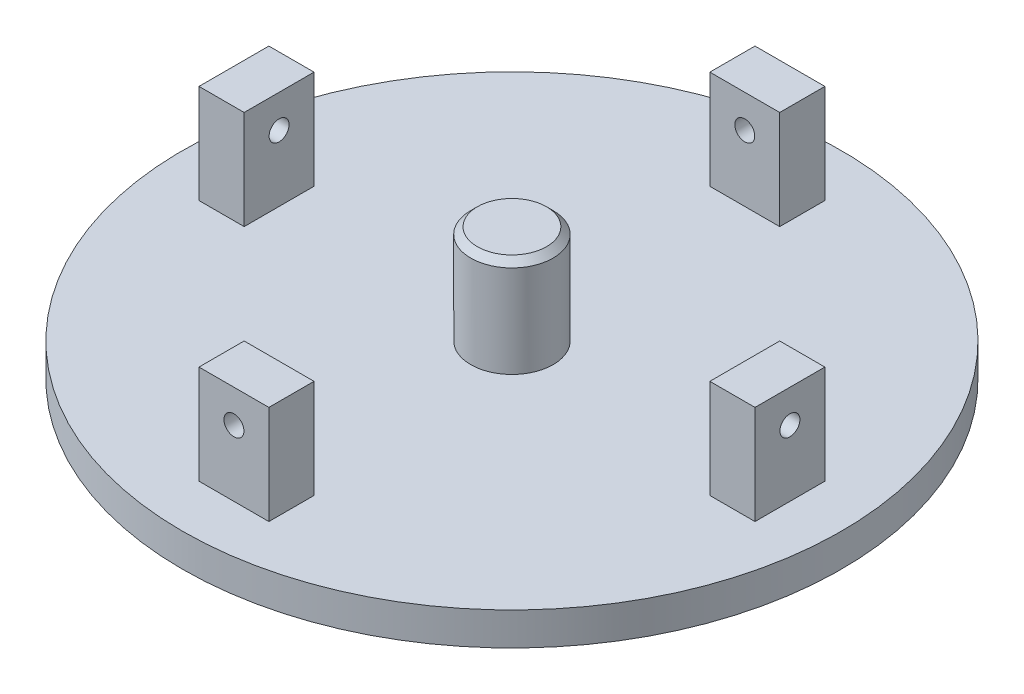
ISO-10303-21;
HEADER;
FILE_DESCRIPTION(('STEP AP214'),'2;1');
FILE_NAME('part.step','',(''),(''),'','','');
FILE_SCHEMA(('AUTOMOTIVE_DESIGN { 1 0 10303 214 1 1 1 1 }'));
ENDSEC;
DATA;
#1=APPLICATION_CONTEXT('core data for automotive mechanical design processes');
#2=APPLICATION_PROTOCOL_DEFINITION('international standard','automotive_design',2000,#1);
#3=PRODUCT_CONTEXT('',#1,'mechanical');
#4=PRODUCT('Part','Part','',(#3));
#5=PRODUCT_RELATED_PRODUCT_CATEGORY('part','',(#4));
#6=PRODUCT_DEFINITION_FORMATION('','',#4);
#7=PRODUCT_DEFINITION_CONTEXT('part definition',#1,'design');
#8=PRODUCT_DEFINITION('design','',#6,#7);
#9=PRODUCT_DEFINITION_SHAPE('','',#8);
#10=(LENGTH_UNIT() NAMED_UNIT(*) SI_UNIT(.MILLI.,.METRE.));
#11=(NAMED_UNIT(*) PLANE_ANGLE_UNIT() SI_UNIT($,.RADIAN.));
#12=(NAMED_UNIT(*) SI_UNIT($,.STERADIAN.) SOLID_ANGLE_UNIT());
#13=UNCERTAINTY_MEASURE_WITH_UNIT(LENGTH_MEASURE(1.E-05),#10,'distance_accuracy_value','');
#14=(GEOMETRIC_REPRESENTATION_CONTEXT(3) GLOBAL_UNCERTAINTY_ASSIGNED_CONTEXT((#13)) GLOBAL_UNIT_ASSIGNED_CONTEXT((#10,
#11,#12)) REPRESENTATION_CONTEXT('',''));
#15=CARTESIAN_POINT('',(0.,0.,0.));
#16=DIRECTION('',(0.,0.,1.));
#17=DIRECTION('',(1.,0.,0.));
#18=AXIS2_PLACEMENT_3D('',#15,#16,#17);
#19=CARTESIAN_POINT('',(0.,10.,0.));
#20=DIRECTION('',(0.,1.,0.));
#21=DIRECTION('',(0.,0.,1.));
#22=AXIS2_PLACEMENT_3D('',#19,#20,#21);
#23=PLANE('',#22);
#24=CARTESIAN_POINT('',(0.,10.,0.));
#25=DIRECTION('',(0.,1.,0.));
#26=DIRECTION('',(0.,0.,1.));
#27=AXIS2_PLACEMENT_3D('',#24,#25,#26);
#28=CIRCLE('',#27,12.5);
#29=CARTESIAN_POINT('',(0.,10.,12.5));
#30=VERTEX_POINT('',#29);
#31=EDGE_CURVE('E635',#30,#30,#28,.T.);
#32=ORIENTED_EDGE('',*,*,#31,.F.);
#33=EDGE_LOOP('',(#32));
#34=FACE_BOUND('',#33,.T.);
#35=CARTESIAN_POINT('',(0.,10.,0.));
#36=DIRECTION('',(0.,1.,0.));
#37=DIRECTION('',(0.,0.,1.));
#38=AXIS2_PLACEMENT_3D('',#35,#36,#37);
#39=CIRCLE('',#38,100.);
#40=CARTESIAN_POINT('',(0.,10.,100.));
#41=VERTEX_POINT('',#40);
#42=EDGE_CURVE('E265',#41,#41,#39,.T.);
#43=ORIENTED_EDGE('',*,*,#42,.T.);
#44=EDGE_LOOP('',(#43));
#45=FACE_BOUND('',#44,.T.);
#46=DIRECTION('',(-1.,0.,0.));
#47=VECTOR('',#46,1.);
#48=CARTESIAN_POINT('',(70.65,10.,-10.6));
#49=LINE('',#48,#47);
#50=CARTESIAN_POINT('',(84.35,10.,-10.6));
#51=VERTEX_POINT('',#50);
#52=CARTESIAN_POINT('',(70.65,10.,-10.6));
#53=VERTEX_POINT('',#52);
#54=EDGE_CURVE('E249',#51,#53,#49,.T.);
#55=ORIENTED_EDGE('',*,*,#54,.F.);
#56=DIRECTION('',(0.,0.,-1.));
#57=VECTOR('',#56,1.);
#58=CARTESIAN_POINT('',(84.35,10.,-10.6));
#59=LINE('',#58,#57);
#60=CARTESIAN_POINT('',(84.35,10.,10.6));
#61=VERTEX_POINT('',#60);
#62=EDGE_CURVE('E235',#61,#51,#59,.T.);
#63=ORIENTED_EDGE('',*,*,#62,.F.);
#64=DIRECTION('',(1.,0.,0.));
#65=VECTOR('',#64,1.);
#66=CARTESIAN_POINT('',(70.65,10.,10.6));
#67=LINE('',#66,#65);
#68=CARTESIAN_POINT('',(70.65,10.,10.6));
#69=VERTEX_POINT('',#68);
#70=EDGE_CURVE('E240',#69,#61,#67,.T.);
#71=ORIENTED_EDGE('',*,*,#70,.F.);
#72=DIRECTION('',(0.,0.,1.));
#73=VECTOR('',#72,1.);
#74=CARTESIAN_POINT('',(70.65,10.,-10.6));
#75=LINE('',#74,#73);
#76=EDGE_CURVE('E251',#53,#69,#75,.T.);
#77=ORIENTED_EDGE('',*,*,#76,.F.);
#78=EDGE_LOOP('',(#55,#63,#71,#77));
#79=FACE_BOUND('',#78,.T.);
#80=DIRECTION('',(1.,0.,0.));
#81=VECTOR('',#80,1.);
#82=CARTESIAN_POINT('',(10.6000000000091,10.,84.3500000000068));
#83=LINE('',#82,#81);
#84=CARTESIAN_POINT('',(-10.5999999999909,10.,84.3500000000068));
#85=VERTEX_POINT('',#84);
#86=CARTESIAN_POINT('',(10.6000000000091,10.,84.3500000000068));
#87=VERTEX_POINT('',#86);
#88=EDGE_CURVE('E220',#85,#87,#83,.T.);
#89=ORIENTED_EDGE('',*,*,#88,.F.);
#90=DIRECTION('',(0.,0.,1.));
#91=VECTOR('',#90,1.);
#92=CARTESIAN_POINT('',(-10.5999999999909,10.,70.6500000000068));
#93=LINE('',#92,#91);
#94=CARTESIAN_POINT('',(-10.5999999999909,10.,70.6500000000068));
#95=VERTEX_POINT('',#94);
#96=EDGE_CURVE('E206',#95,#85,#93,.T.);
#97=ORIENTED_EDGE('',*,*,#96,.F.);
#98=DIRECTION('',(-1.,0.,0.));
#99=VECTOR('',#98,1.);
#100=CARTESIAN_POINT('',(10.6000000000091,10.,70.6500000000068));
#101=LINE('',#100,#99);
#102=CARTESIAN_POINT('',(10.6000000000091,10.,70.6500000000068));
#103=VERTEX_POINT('',#102);
#104=EDGE_CURVE('E211',#103,#95,#101,.T.);
#105=ORIENTED_EDGE('',*,*,#104,.F.);
#106=DIRECTION('',(0.,0.,-1.));
#107=VECTOR('',#106,1.);
#108=CARTESIAN_POINT('',(10.6000000000091,10.,70.6500000000068));
#109=LINE('',#108,#107);
#110=EDGE_CURVE('E222',#87,#103,#109,.T.);
#111=ORIENTED_EDGE('',*,*,#110,.F.);
#112=EDGE_LOOP('',(#89,#97,#105,#111));
#113=FACE_BOUND('',#112,.T.);
#114=DIRECTION('',(0.,0.,1.));
#115=VECTOR('',#114,1.);
#116=CARTESIAN_POINT('',(-84.3499999999977,10.,10.6000000000159));
#117=LINE('',#116,#115);
#118=CARTESIAN_POINT('',(-84.3499999999977,10.,-10.5999999999841));
#119=VERTEX_POINT('',#118);
#120=CARTESIAN_POINT('',(-84.3499999999977,10.,10.6000000000159));
#121=VERTEX_POINT('',#120);
#122=EDGE_CURVE('E178',#119,#121,#117,.T.);
#123=ORIENTED_EDGE('',*,*,#122,.F.);
#124=DIRECTION('',(-1.,0.,0.));
#125=VECTOR('',#124,1.);
#126=CARTESIAN_POINT('',(-70.6499999999977,10.,-10.5999999999841));
#127=LINE('',#126,#125);
#128=CARTESIAN_POINT('',(-70.6499999999977,10.,-10.5999999999841));
#129=VERTEX_POINT('',#128);
#130=EDGE_CURVE('E175',#129,#119,#127,.T.);
#131=ORIENTED_EDGE('',*,*,#130,.F.);
#132=DIRECTION('',(0.,0.,-1.));
#133=VECTOR('',#132,1.);
#134=CARTESIAN_POINT('',(-70.6499999999977,10.,10.6000000000159));
#135=LINE('',#134,#133);
#136=CARTESIAN_POINT('',(-70.6499999999977,10.,10.6000000000159));
#137=VERTEX_POINT('',#136);
#138=EDGE_CURVE('E187',#137,#129,#135,.T.);
#139=ORIENTED_EDGE('',*,*,#138,.F.);
#140=DIRECTION('',(1.,0.,0.));
#141=VECTOR('',#140,1.);
#142=CARTESIAN_POINT('',(-70.6499999999977,10.,10.6000000000159));
#143=LINE('',#142,#141);
#144=EDGE_CURVE('E195',#121,#137,#143,.T.);
#145=ORIENTED_EDGE('',*,*,#144,.F.);
#146=EDGE_LOOP('',(#123,#131,#139,#145));
#147=FACE_BOUND('',#146,.T.);
#148=DIRECTION('',(-1.,0.,0.));
#149=VECTOR('',#148,1.);
#150=CARTESIAN_POINT('',(-10.6000000000069,10.,-84.3499999999909));
#151=LINE('',#150,#149);
#152=CARTESIAN_POINT('',(10.5999999999931,10.,-84.3499999999909));
#153=VERTEX_POINT('',#152);
#154=CARTESIAN_POINT('',(-10.6000000000069,10.,-84.3499999999909));
#155=VERTEX_POINT('',#154);
#156=EDGE_CURVE('E612',#153,#155,#151,.T.);
#157=ORIENTED_EDGE('',*,*,#156,.F.);
#158=DIRECTION('',(0.,0.,-1.));
#159=VECTOR('',#158,1.);
#160=CARTESIAN_POINT('',(10.5999999999931,10.,-70.6499999999909));
#161=LINE('',#160,#159);
#162=CARTESIAN_POINT('',(10.5999999999931,10.,-70.6499999999909));
#163=VERTEX_POINT('',#162);
#164=EDGE_CURVE('E173',#163,#153,#161,.T.);
#165=ORIENTED_EDGE('',*,*,#164,.F.);
#166=DIRECTION('',(1.,0.,0.));
#167=VECTOR('',#166,1.);
#168=CARTESIAN_POINT('',(-10.6000000000069,10.,-70.6499999999909));
#169=LINE('',#168,#167);
#170=CARTESIAN_POINT('',(-10.6000000000069,10.,-70.6499999999909));
#171=VERTEX_POINT('',#170);
#172=EDGE_CURVE('E169',#171,#163,#169,.T.);
#173=ORIENTED_EDGE('',*,*,#172,.F.);
#174=DIRECTION('',(0.,0.,1.));
#175=VECTOR('',#174,1.);
#176=CARTESIAN_POINT('',(-10.6000000000069,10.,-70.6499999999909));
#177=LINE('',#176,#175);
#178=EDGE_CURVE('E614',#155,#171,#177,.T.);
#179=ORIENTED_EDGE('',*,*,#178,.F.);
#180=EDGE_LOOP('',(#157,#165,#173,#179));
#181=FACE_BOUND('',#180,.T.);
#182=ADVANCED_FACE('F35',(#34,#45,#79,#113,#147,#181),#23,.T.);
#183=CARTESIAN_POINT('',(0.,10.,0.));
#184=DIRECTION('',(0.,-1.,0.));
#185=DIRECTION('',(0.,0.,-1.));
#186=AXIS2_PLACEMENT_3D('',#183,#184,#185);
#187=CYLINDRICAL_SURFACE('',#186,100.);
#188=ORIENTED_EDGE('',*,*,#42,.F.);
#189=EDGE_LOOP('',(#188));
#190=FACE_BOUND('',#189,.T.);
#191=CARTESIAN_POINT('',(0.,0.,0.));
#192=DIRECTION('',(0.,1.,0.));
#193=DIRECTION('',(0.,0.,1.));
#194=AXIS2_PLACEMENT_3D('',#191,#192,#193);
#195=CIRCLE('',#194,100.);
#196=CARTESIAN_POINT('',(0.,0.,100.));
#197=VERTEX_POINT('',#196);
#198=EDGE_CURVE('E264',#197,#197,#195,.T.);
#199=ORIENTED_EDGE('',*,*,#198,.T.);
#200=EDGE_LOOP('',(#199));
#201=FACE_BOUND('',#200,.T.);
#202=ADVANCED_FACE('F295',(#190,#201),#187,.T.);
#203=CARTESIAN_POINT('',(0.,0.,0.));
#204=DIRECTION('',(0.,1.,0.));
#205=DIRECTION('',(0.,0.,1.));
#206=AXIS2_PLACEMENT_3D('',#203,#204,#205);
#207=PLANE('',#206);
#208=ORIENTED_EDGE('',*,*,#198,.F.);
#209=EDGE_LOOP('',(#208));
#210=FACE_BOUND('',#209,.T.);
#211=ADVANCED_FACE('F301',(#210),#207,.F.);
#212=CARTESIAN_POINT('',(84.35,40.,-10.6));
#213=DIRECTION('',(-1.,0.,0.));
#214=DIRECTION('',(0.,0.,1.));
#215=AXIS2_PLACEMENT_3D('',#212,#213,#214);
#216=PLANE('',#215);
#217=CARTESIAN_POINT('',(84.35,30.,0.));
#218=DIRECTION('',(-1.,0.,0.));
#219=DIRECTION('',(0.,0.,1.));
#220=AXIS2_PLACEMENT_3D('',#217,#218,#219);
#221=CIRCLE('',#220,3.025);
#222=CARTESIAN_POINT('',(84.35,30.,3.025));
#223=VERTEX_POINT('',#222);
#224=EDGE_CURVE('E326',#223,#223,#221,.T.);
#225=ORIENTED_EDGE('',*,*,#224,.T.);
#226=EDGE_LOOP('',(#225));
#227=FACE_BOUND('',#226,.T.);
#228=ORIENTED_EDGE('',*,*,#62,.T.);
#229=DIRECTION('',(0.,-1.,0.));
#230=VECTOR('',#229,1.);
#231=CARTESIAN_POINT('',(84.35,40.,-10.6));
#232=LINE('',#231,#230);
#233=CARTESIAN_POINT('',(84.35,40.,-10.6));
#234=VERTEX_POINT('',#233);
#235=EDGE_CURVE('E262',#234,#51,#232,.T.);
#236=ORIENTED_EDGE('',*,*,#235,.F.);
#237=DIRECTION('',(0.,0.,-1.));
#238=VECTOR('',#237,1.);
#239=CARTESIAN_POINT('',(84.35,40.,-10.6));
#240=LINE('',#239,#238);
#241=CARTESIAN_POINT('',(84.35,40.,10.6));
#242=VERTEX_POINT('',#241);
#243=EDGE_CURVE('E236',#242,#234,#240,.T.);
#244=ORIENTED_EDGE('',*,*,#243,.F.);
#245=DIRECTION('',(0.,-1.,0.));
#246=VECTOR('',#245,1.);
#247=CARTESIAN_POINT('',(84.35,40.,10.6));
#248=LINE('',#247,#246);
#249=EDGE_CURVE('E246',#242,#61,#248,.T.);
#250=ORIENTED_EDGE('',*,*,#249,.T.);
#251=EDGE_LOOP('',(#228,#236,#244,#250));
#252=FACE_BOUND('',#251,.T.);
#253=ADVANCED_FACE('F307',(#227,#252),#216,.F.);
#254=CARTESIAN_POINT('',(70.65,40.,-10.6));
#255=DIRECTION('',(0.,0.,1.));
#256=DIRECTION('',(1.,0.,0.));
#257=AXIS2_PLACEMENT_3D('',#254,#255,#256);
#258=PLANE('',#257);
#259=ORIENTED_EDGE('',*,*,#54,.T.);
#260=DIRECTION('',(0.,-1.,0.));
#261=VECTOR('',#260,1.);
#262=CARTESIAN_POINT('',(70.65,40.,-10.6));
#263=LINE('',#262,#261);
#264=CARTESIAN_POINT('',(70.65,40.,-10.6));
#265=VERTEX_POINT('',#264);
#266=EDGE_CURVE('E259',#265,#53,#263,.T.);
#267=ORIENTED_EDGE('',*,*,#266,.F.);
#268=DIRECTION('',(-1.,0.,0.));
#269=VECTOR('',#268,1.);
#270=CARTESIAN_POINT('',(70.65,40.,-10.6));
#271=LINE('',#270,#269);
#272=EDGE_CURVE('E239',#234,#265,#271,.T.);
#273=ORIENTED_EDGE('',*,*,#272,.F.);
#274=ORIENTED_EDGE('',*,*,#235,.T.);
#275=EDGE_LOOP('',(#259,#267,#273,#274));
#276=FACE_BOUND('',#275,.T.);
#277=ADVANCED_FACE('F314',(#276),#258,.F.);
#278=CARTESIAN_POINT('',(70.65,40.,-10.6));
#279=DIRECTION('',(1.,0.,0.));
#280=DIRECTION('',(0.,0.,-1.));
#281=AXIS2_PLACEMENT_3D('',#278,#279,#280);
#282=PLANE('',#281);
#283=CARTESIAN_POINT('',(70.65,30.,0.));
#284=DIRECTION('',(1.,0.,0.));
#285=DIRECTION('',(0.,0.,-1.));
#286=AXIS2_PLACEMENT_3D('',#283,#284,#285);
#287=CIRCLE('',#286,3.025);
#288=CARTESIAN_POINT('',(70.65,30.,-3.025));
#289=VERTEX_POINT('',#288);
#290=EDGE_CURVE('E273',#289,#289,#287,.T.);
#291=ORIENTED_EDGE('',*,*,#290,.T.);
#292=EDGE_LOOP('',(#291));
#293=FACE_BOUND('',#292,.T.);
#294=ORIENTED_EDGE('',*,*,#76,.T.);
#295=DIRECTION('',(0.,-1.,0.));
#296=VECTOR('',#295,1.);
#297=CARTESIAN_POINT('',(70.65,40.,10.6));
#298=LINE('',#297,#296);
#299=CARTESIAN_POINT('',(70.65,40.,10.6));
#300=VERTEX_POINT('',#299);
#301=EDGE_CURVE('E257',#300,#69,#298,.T.);
#302=ORIENTED_EDGE('',*,*,#301,.F.);
#303=DIRECTION('',(0.,0.,1.));
#304=VECTOR('',#303,1.);
#305=CARTESIAN_POINT('',(70.65,40.,-10.6));
#306=LINE('',#305,#304);
#307=EDGE_CURVE('E242',#265,#300,#306,.T.);
#308=ORIENTED_EDGE('',*,*,#307,.F.);
#309=ORIENTED_EDGE('',*,*,#266,.T.);
#310=EDGE_LOOP('',(#294,#302,#308,#309));
#311=FACE_BOUND('',#310,.T.);
#312=ADVANCED_FACE('F321',(#293,#311),#282,.F.);
#313=CARTESIAN_POINT('',(70.65,40.,10.6));
#314=DIRECTION('',(0.,0.,-1.));
#315=DIRECTION('',(-1.,0.,0.));
#316=AXIS2_PLACEMENT_3D('',#313,#314,#315);
#317=PLANE('',#316);
#318=ORIENTED_EDGE('',*,*,#70,.T.);
#319=ORIENTED_EDGE('',*,*,#249,.F.);
#320=DIRECTION('',(1.,0.,0.));
#321=VECTOR('',#320,1.);
#322=CARTESIAN_POINT('',(70.65,40.,10.6));
#323=LINE('',#322,#321);
#324=EDGE_CURVE('E244',#300,#242,#323,.T.);
#325=ORIENTED_EDGE('',*,*,#324,.F.);
#326=ORIENTED_EDGE('',*,*,#301,.T.);
#327=EDGE_LOOP('',(#318,#319,#325,#326));
#328=FACE_BOUND('',#327,.T.);
#329=ADVANCED_FACE('F344',(#328),#317,.F.);
#330=CARTESIAN_POINT('',(0.,40.,0.));
#331=DIRECTION('',(0.,1.,0.));
#332=DIRECTION('',(0.,0.,1.));
#333=AXIS2_PLACEMENT_3D('',#330,#331,#332);
#334=PLANE('',#333);
#335=ORIENTED_EDGE('',*,*,#243,.T.);
#336=ORIENTED_EDGE('',*,*,#272,.T.);
#337=ORIENTED_EDGE('',*,*,#307,.T.);
#338=ORIENTED_EDGE('',*,*,#324,.T.);
#339=EDGE_LOOP('',(#335,#336,#337,#338));
#340=FACE_BOUND('',#339,.T.);
#341=ADVANCED_FACE('F342',(#340),#334,.T.);
#342=CARTESIAN_POINT('',(-10.5999999999909,40.,70.6500000000068));
#343=DIRECTION('',(1.,0.,0.));
#344=DIRECTION('',(0.,0.,-1.));
#345=AXIS2_PLACEMENT_3D('',#342,#343,#344);
#346=PLANE('',#345);
#347=ORIENTED_EDGE('',*,*,#96,.T.);
#348=DIRECTION('',(0.,-1.,0.));
#349=VECTOR('',#348,1.);
#350=CARTESIAN_POINT('',(-10.5999999999909,40.,84.3500000000068));
#351=LINE('',#350,#349);
#352=CARTESIAN_POINT('',(-10.5999999999909,40.,84.3500000000068));
#353=VERTEX_POINT('',#352);
#354=EDGE_CURVE('E233',#353,#85,#351,.T.);
#355=ORIENTED_EDGE('',*,*,#354,.F.);
#356=DIRECTION('',(0.,0.,1.));
#357=VECTOR('',#356,1.);
#358=CARTESIAN_POINT('',(-10.5999999999909,40.,70.6500000000068));
#359=LINE('',#358,#357);
#360=CARTESIAN_POINT('',(-10.5999999999909,40.,70.6500000000068));
#361=VERTEX_POINT('',#360);
#362=EDGE_CURVE('E207',#361,#353,#359,.T.);
#363=ORIENTED_EDGE('',*,*,#362,.F.);
#364=DIRECTION('',(0.,-1.,0.));
#365=VECTOR('',#364,1.);
#366=CARTESIAN_POINT('',(-10.5999999999909,40.,70.6500000000068));
#367=LINE('',#366,#365);
#368=EDGE_CURVE('E217',#361,#95,#367,.T.);
#369=ORIENTED_EDGE('',*,*,#368,.T.);
#370=EDGE_LOOP('',(#347,#355,#363,#369));
#371=FACE_BOUND('',#370,.T.);
#372=ADVANCED_FACE('F351',(#371),#346,.F.);
#373=CARTESIAN_POINT('',(10.6000000000091,40.,84.3500000000068));
#374=DIRECTION('',(0.,0.,-1.));
#375=DIRECTION('',(-1.,0.,0.));
#376=AXIS2_PLACEMENT_3D('',#373,#374,#375);
#377=PLANE('',#376);
#378=CARTESIAN_POINT('',(0.,30.,84.3500000000068));
#379=DIRECTION('',(0.,0.,1.));
#380=DIRECTION('',(1.,0.,0.));
#381=AXIS2_PLACEMENT_3D('',#378,#379,#380);
#382=CIRCLE('',#381,3.025);
#383=CARTESIAN_POINT('',(3.025,30.,84.3500000000068));
#384=VERTEX_POINT('',#383);
#385=EDGE_CURVE('E278',#384,#384,#382,.T.);
#386=ORIENTED_EDGE('',*,*,#385,.F.);
#387=EDGE_LOOP('',(#386));
#388=FACE_BOUND('',#387,.T.);
#389=ORIENTED_EDGE('',*,*,#88,.T.);
#390=DIRECTION('',(0.,-1.,0.));
#391=VECTOR('',#390,1.);
#392=CARTESIAN_POINT('',(10.6000000000091,40.,84.3500000000068));
#393=LINE('',#392,#391);
#394=CARTESIAN_POINT('',(10.6000000000091,40.,84.3500000000068));
#395=VERTEX_POINT('',#394);
#396=EDGE_CURVE('E230',#395,#87,#393,.T.);
#397=ORIENTED_EDGE('',*,*,#396,.F.);
#398=DIRECTION('',(1.,0.,0.));
#399=VECTOR('',#398,1.);
#400=CARTESIAN_POINT('',(10.6000000000091,40.,84.3500000000068));
#401=LINE('',#400,#399);
#402=EDGE_CURVE('E210',#353,#395,#401,.T.);
#403=ORIENTED_EDGE('',*,*,#402,.F.);
#404=ORIENTED_EDGE('',*,*,#354,.T.);
#405=EDGE_LOOP('',(#389,#397,#403,#404));
#406=FACE_BOUND('',#405,.T.);
#407=ADVANCED_FACE('F358',(#388,#406),#377,.F.);
#408=CARTESIAN_POINT('',(10.6000000000091,40.,70.6500000000068));
#409=DIRECTION('',(-1.,0.,0.));
#410=DIRECTION('',(0.,0.,1.));
#411=AXIS2_PLACEMENT_3D('',#408,#409,#410);
#412=PLANE('',#411);
#413=ORIENTED_EDGE('',*,*,#110,.T.);
#414=DIRECTION('',(0.,-1.,0.));
#415=VECTOR('',#414,1.);
#416=CARTESIAN_POINT('',(10.6000000000091,40.,70.6500000000068));
#417=LINE('',#416,#415);
#418=CARTESIAN_POINT('',(10.6000000000091,40.,70.6500000000068));
#419=VERTEX_POINT('',#418);
#420=EDGE_CURVE('E228',#419,#103,#417,.T.);
#421=ORIENTED_EDGE('',*,*,#420,.F.);
#422=DIRECTION('',(0.,0.,-1.));
#423=VECTOR('',#422,1.);
#424=CARTESIAN_POINT('',(10.6000000000091,40.,70.6500000000068));
#425=LINE('',#424,#423);
#426=EDGE_CURVE('E213',#395,#419,#425,.T.);
#427=ORIENTED_EDGE('',*,*,#426,.F.);
#428=ORIENTED_EDGE('',*,*,#396,.T.);
#429=EDGE_LOOP('',(#413,#421,#427,#428));
#430=FACE_BOUND('',#429,.T.);
#431=ADVANCED_FACE('F362',(#430),#412,.F.);
#432=CARTESIAN_POINT('',(10.6000000000091,40.,70.6500000000068));
#433=DIRECTION('',(0.,0.,1.));
#434=DIRECTION('',(1.,0.,0.));
#435=AXIS2_PLACEMENT_3D('',#432,#433,#434);
#436=PLANE('',#435);
#437=CARTESIAN_POINT('',(0.,30.,70.6500000000068));
#438=DIRECTION('',(0.,0.,1.));
#439=DIRECTION('',(1.,0.,0.));
#440=AXIS2_PLACEMENT_3D('',#437,#438,#439);
#441=CIRCLE('',#440,3.025);
#442=CARTESIAN_POINT('',(3.025,30.,70.6500000000068));
#443=VERTEX_POINT('',#442);
#444=EDGE_CURVE('E628',#443,#443,#441,.T.);
#445=ORIENTED_EDGE('',*,*,#444,.T.);
#446=EDGE_LOOP('',(#445));
#447=FACE_BOUND('',#446,.T.);
#448=ORIENTED_EDGE('',*,*,#104,.T.);
#449=ORIENTED_EDGE('',*,*,#368,.F.);
#450=DIRECTION('',(-1.,0.,0.));
#451=VECTOR('',#450,1.);
#452=CARTESIAN_POINT('',(10.6000000000091,40.,70.6500000000068));
#453=LINE('',#452,#451);
#454=EDGE_CURVE('E215',#419,#361,#453,.T.);
#455=ORIENTED_EDGE('',*,*,#454,.F.);
#456=ORIENTED_EDGE('',*,*,#420,.T.);
#457=EDGE_LOOP('',(#448,#449,#455,#456));
#458=FACE_BOUND('',#457,.T.);
#459=ADVANCED_FACE('F366',(#447,#458),#436,.F.);
#460=CARTESIAN_POINT('',(0.,40.,0.));
#461=DIRECTION('',(0.,-1.,0.));
#462=DIRECTION('',(0.,0.,-1.));
#463=AXIS2_PLACEMENT_3D('',#460,#461,#462);
#464=PLANE('',#463);
#465=ORIENTED_EDGE('',*,*,#362,.T.);
#466=ORIENTED_EDGE('',*,*,#402,.T.);
#467=ORIENTED_EDGE('',*,*,#426,.T.);
#468=ORIENTED_EDGE('',*,*,#454,.T.);
#469=EDGE_LOOP('',(#465,#466,#467,#468));
#470=FACE_BOUND('',#469,.T.);
#471=ADVANCED_FACE('F370',(#470),#464,.F.);
#472=CARTESIAN_POINT('',(-70.6499999999977,40.,-10.5999999999841));
#473=DIRECTION('',(0.,0.,1.));
#474=DIRECTION('',(1.,0.,0.));
#475=AXIS2_PLACEMENT_3D('',#472,#473,#474);
#476=PLANE('',#475);
#477=ORIENTED_EDGE('',*,*,#130,.T.);
#478=DIRECTION('',(0.,-1.,0.));
#479=VECTOR('',#478,1.);
#480=CARTESIAN_POINT('',(-84.3499999999977,40.,-10.5999999999841));
#481=LINE('',#480,#479);
#482=CARTESIAN_POINT('',(-84.3499999999977,40.,-10.5999999999841));
#483=VERTEX_POINT('',#482);
#484=EDGE_CURVE('E204',#483,#119,#481,.T.);
#485=ORIENTED_EDGE('',*,*,#484,.F.);
#486=DIRECTION('',(-1.,0.,0.));
#487=VECTOR('',#486,1.);
#488=CARTESIAN_POINT('',(-70.6499999999977,40.,-10.5999999999841));
#489=LINE('',#488,#487);
#490=CARTESIAN_POINT('',(-70.6499999999977,40.,-10.5999999999841));
#491=VERTEX_POINT('',#490);
#492=EDGE_CURVE('E183',#491,#483,#489,.T.);
#493=ORIENTED_EDGE('',*,*,#492,.F.);
#494=DIRECTION('',(0.,-1.,0.));
#495=VECTOR('',#494,1.);
#496=CARTESIAN_POINT('',(-70.6499999999977,40.,-10.5999999999841));
#497=LINE('',#496,#495);
#498=EDGE_CURVE('E192',#491,#129,#497,.T.);
#499=ORIENTED_EDGE('',*,*,#498,.T.);
#500=EDGE_LOOP('',(#477,#485,#493,#499));
#501=FACE_BOUND('',#500,.T.);
#502=ADVANCED_FACE('F374',(#501),#476,.F.);
#503=CARTESIAN_POINT('',(-84.3499999999977,40.,10.6000000000159));
#504=DIRECTION('',(1.,0.,0.));
#505=DIRECTION('',(0.,0.,-1.));
#506=AXIS2_PLACEMENT_3D('',#503,#504,#505);
#507=PLANE('',#506);
#508=CARTESIAN_POINT('',(-84.3499999999977,30.,0.));
#509=DIRECTION('',(-1.,0.,0.));
#510=DIRECTION('',(0.,0.,1.));
#511=AXIS2_PLACEMENT_3D('',#508,#509,#510);
#512=CIRCLE('',#511,3.025);
#513=CARTESIAN_POINT('',(-84.3499999999977,30.,3.025));
#514=VERTEX_POINT('',#513);
#515=EDGE_CURVE('E274',#514,#514,#512,.T.);
#516=ORIENTED_EDGE('',*,*,#515,.F.);
#517=EDGE_LOOP('',(#516));
#518=FACE_BOUND('',#517,.T.);
#519=ORIENTED_EDGE('',*,*,#122,.T.);
#520=DIRECTION('',(0.,-1.,0.));
#521=VECTOR('',#520,1.);
#522=CARTESIAN_POINT('',(-84.3499999999977,40.,10.6000000000159));
#523=LINE('',#522,#521);
#524=CARTESIAN_POINT('',(-84.3499999999977,40.,10.6000000000159));
#525=VERTEX_POINT('',#524);
#526=EDGE_CURVE('E201',#525,#121,#523,.T.);
#527=ORIENTED_EDGE('',*,*,#526,.F.);
#528=DIRECTION('',(0.,0.,1.));
#529=VECTOR('',#528,1.);
#530=CARTESIAN_POINT('',(-84.3499999999977,40.,10.6000000000159));
#531=LINE('',#530,#529);
#532=EDGE_CURVE('E186',#483,#525,#531,.T.);
#533=ORIENTED_EDGE('',*,*,#532,.F.);
#534=ORIENTED_EDGE('',*,*,#484,.T.);
#535=EDGE_LOOP('',(#519,#527,#533,#534));
#536=FACE_BOUND('',#535,.T.);
#537=ADVANCED_FACE('F378',(#518,#536),#507,.F.);
#538=CARTESIAN_POINT('',(-70.6499999999977,40.,10.6000000000159));
#539=DIRECTION('',(0.,0.,-1.));
#540=DIRECTION('',(-1.,0.,0.));
#541=AXIS2_PLACEMENT_3D('',#538,#539,#540);
#542=PLANE('',#541);
#543=ORIENTED_EDGE('',*,*,#144,.T.);
#544=DIRECTION('',(0.,-1.,0.));
#545=VECTOR('',#544,1.);
#546=CARTESIAN_POINT('',(-70.6499999999977,40.,10.6000000000159));
#547=LINE('',#546,#545);
#548=CARTESIAN_POINT('',(-70.6499999999977,40.,10.6000000000159));
#549=VERTEX_POINT('',#548);
#550=EDGE_CURVE('E59',#549,#137,#547,.T.);
#551=ORIENTED_EDGE('',*,*,#550,.F.);
#552=DIRECTION('',(1.,0.,0.));
#553=VECTOR('',#552,1.);
#554=CARTESIAN_POINT('',(-70.6499999999977,40.,10.6000000000159));
#555=LINE('',#554,#553);
#556=EDGE_CURVE('E189',#525,#549,#555,.T.);
#557=ORIENTED_EDGE('',*,*,#556,.F.);
#558=ORIENTED_EDGE('',*,*,#526,.T.);
#559=EDGE_LOOP('',(#543,#551,#557,#558));
#560=FACE_BOUND('',#559,.T.);
#561=ADVANCED_FACE('F382',(#560),#542,.F.);
#562=CARTESIAN_POINT('',(-70.6499999999977,40.,10.6000000000159));
#563=DIRECTION('',(-1.,0.,0.));
#564=DIRECTION('',(0.,0.,1.));
#565=AXIS2_PLACEMENT_3D('',#562,#563,#564);
#566=PLANE('',#565);
#567=CARTESIAN_POINT('',(-70.6499999999977,30.,0.));
#568=DIRECTION('',(-1.,0.,0.));
#569=DIRECTION('',(0.,0.,1.));
#570=AXIS2_PLACEMENT_3D('',#567,#568,#569);
#571=CIRCLE('',#570,3.025);
#572=CARTESIAN_POINT('',(-70.6499999999977,30.,3.025));
#573=VERTEX_POINT('',#572);
#574=EDGE_CURVE('E270',#573,#573,#571,.T.);
#575=ORIENTED_EDGE('',*,*,#574,.T.);
#576=EDGE_LOOP('',(#575));
#577=FACE_BOUND('',#576,.T.);
#578=ORIENTED_EDGE('',*,*,#138,.T.);
#579=ORIENTED_EDGE('',*,*,#498,.F.);
#580=DIRECTION('',(0.,0.,-1.));
#581=VECTOR('',#580,1.);
#582=CARTESIAN_POINT('',(-70.6499999999977,40.,10.6000000000159));
#583=LINE('',#582,#581);
#584=EDGE_CURVE('E191',#549,#491,#583,.T.);
#585=ORIENTED_EDGE('',*,*,#584,.F.);
#586=ORIENTED_EDGE('',*,*,#550,.T.);
#587=EDGE_LOOP('',(#578,#579,#585,#586));
#588=FACE_BOUND('',#587,.T.);
#589=ADVANCED_FACE('F386',(#577,#588),#566,.F.);
#590=CARTESIAN_POINT('',(0.,40.,0.));
#591=DIRECTION('',(0.,-1.,0.));
#592=DIRECTION('',(0.,0.,-1.));
#593=AXIS2_PLACEMENT_3D('',#590,#591,#592);
#594=PLANE('',#593);
#595=ORIENTED_EDGE('',*,*,#492,.T.);
#596=ORIENTED_EDGE('',*,*,#532,.T.);
#597=ORIENTED_EDGE('',*,*,#556,.T.);
#598=ORIENTED_EDGE('',*,*,#584,.T.);
#599=EDGE_LOOP('',(#595,#596,#597,#598));
#600=FACE_BOUND('',#599,.T.);
#601=ADVANCED_FACE('F390',(#600),#594,.F.);
#602=CARTESIAN_POINT('',(10.5999999999931,40.,-70.6499999999909));
#603=DIRECTION('',(-1.,0.,0.));
#604=DIRECTION('',(0.,0.,1.));
#605=AXIS2_PLACEMENT_3D('',#602,#603,#604);
#606=PLANE('',#605);
#607=ORIENTED_EDGE('',*,*,#164,.T.);
#608=DIRECTION('',(0.,-1.,0.));
#609=VECTOR('',#608,1.);
#610=CARTESIAN_POINT('',(10.5999999999931,40.,-84.3499999999909));
#611=LINE('',#610,#609);
#612=CARTESIAN_POINT('',(10.5999999999931,40.,-84.3499999999909));
#613=VERTEX_POINT('',#612);
#614=EDGE_CURVE('E154',#613,#153,#611,.T.);
#615=ORIENTED_EDGE('',*,*,#614,.F.);
#616=DIRECTION('',(0.,0.,-1.));
#617=VECTOR('',#616,1.);
#618=CARTESIAN_POINT('',(10.5999999999931,40.,-70.6499999999909));
#619=LINE('',#618,#617);
#620=CARTESIAN_POINT('',(10.5999999999931,40.,-70.6499999999909));
#621=VERTEX_POINT('',#620);
#622=EDGE_CURVE('E161',#621,#613,#619,.T.);
#623=ORIENTED_EDGE('',*,*,#622,.F.);
#624=DIRECTION('',(0.,-1.,0.));
#625=VECTOR('',#624,1.);
#626=CARTESIAN_POINT('',(10.5999999999931,40.,-70.6499999999909));
#627=LINE('',#626,#625);
#628=EDGE_CURVE('E621',#621,#163,#627,.T.);
#629=ORIENTED_EDGE('',*,*,#628,.T.);
#630=EDGE_LOOP('',(#607,#615,#623,#629));
#631=FACE_BOUND('',#630,.T.);
#632=ADVANCED_FACE('F171',(#631),#606,.F.);
#633=CARTESIAN_POINT('',(-10.6000000000069,40.,-84.3499999999909));
#634=DIRECTION('',(0.,0.,1.));
#635=DIRECTION('',(1.,0.,0.));
#636=AXIS2_PLACEMENT_3D('',#633,#634,#635);
#637=PLANE('',#636);
#638=CARTESIAN_POINT('',(0.,30.,-84.3499999999909));
#639=DIRECTION('',(0.,0.,1.));
#640=DIRECTION('',(1.,0.,0.));
#641=AXIS2_PLACEMENT_3D('',#638,#639,#640);
#642=CIRCLE('',#641,3.025);
#643=CARTESIAN_POINT('',(3.025,30.,-84.3499999999909));
#644=VERTEX_POINT('',#643);
#645=EDGE_CURVE('E277',#644,#644,#642,.T.);
#646=ORIENTED_EDGE('',*,*,#645,.T.);
#647=EDGE_LOOP('',(#646));
#648=FACE_BOUND('',#647,.T.);
#649=ORIENTED_EDGE('',*,*,#156,.T.);
#650=DIRECTION('',(0.,-1.,0.));
#651=VECTOR('',#650,1.);
#652=CARTESIAN_POINT('',(-10.6000000000069,40.,-84.3499999999909));
#653=LINE('',#652,#651);
#654=CARTESIAN_POINT('',(-10.6000000000069,40.,-84.3499999999909));
#655=VERTEX_POINT('',#654);
#656=EDGE_CURVE('E157',#655,#155,#653,.T.);
#657=ORIENTED_EDGE('',*,*,#656,.F.);
#658=DIRECTION('',(-1.,0.,0.));
#659=VECTOR('',#658,1.);
#660=CARTESIAN_POINT('',(-10.6000000000069,40.,-84.3499999999909));
#661=LINE('',#660,#659);
#662=EDGE_CURVE('E150',#613,#655,#661,.T.);
#663=ORIENTED_EDGE('',*,*,#662,.F.);
#664=ORIENTED_EDGE('',*,*,#614,.T.);
#665=EDGE_LOOP('',(#649,#657,#663,#664));
#666=FACE_BOUND('',#665,.T.);
#667=ADVANCED_FACE('F152',(#648,#666),#637,.F.);
#668=CARTESIAN_POINT('',(-10.6000000000069,40.,-70.6499999999909));
#669=DIRECTION('',(1.,0.,0.));
#670=DIRECTION('',(0.,0.,-1.));
#671=AXIS2_PLACEMENT_3D('',#668,#669,#670);
#672=PLANE('',#671);
#673=ORIENTED_EDGE('',*,*,#178,.T.);
#674=DIRECTION('',(0.,-1.,0.));
#675=VECTOR('',#674,1.);
#676=CARTESIAN_POINT('',(-10.6000000000069,40.,-70.6499999999909));
#677=LINE('',#676,#675);
#678=CARTESIAN_POINT('',(-10.6000000000069,40.,-70.6499999999909));
#679=VERTEX_POINT('',#678);
#680=EDGE_CURVE('E51',#679,#171,#677,.T.);
#681=ORIENTED_EDGE('',*,*,#680,.F.);
#682=DIRECTION('',(0.,0.,1.));
#683=VECTOR('',#682,1.);
#684=CARTESIAN_POINT('',(-10.6000000000069,40.,-70.6499999999909));
#685=LINE('',#684,#683);
#686=EDGE_CURVE('E160',#655,#679,#685,.T.);
#687=ORIENTED_EDGE('',*,*,#686,.F.);
#688=ORIENTED_EDGE('',*,*,#656,.T.);
#689=EDGE_LOOP('',(#673,#681,#687,#688));
#690=FACE_BOUND('',#689,.T.);
#691=ADVANCED_FACE('F399',(#690),#672,.F.);
#692=CARTESIAN_POINT('',(-10.6000000000069,40.,-70.6499999999909));
#693=DIRECTION('',(0.,0.,-1.));
#694=DIRECTION('',(-1.,0.,0.));
#695=AXIS2_PLACEMENT_3D('',#692,#693,#694);
#696=PLANE('',#695);
#697=CARTESIAN_POINT('',(0.,30.,-70.6499999999909));
#698=DIRECTION('',(0.,0.,-1.));
#699=DIRECTION('',(-1.,0.,0.));
#700=AXIS2_PLACEMENT_3D('',#697,#698,#699);
#701=CIRCLE('',#700,3.025);
#702=CARTESIAN_POINT('',(-3.025,30.,-70.6499999999909));
#703=VERTEX_POINT('',#702);
#704=EDGE_CURVE('E275',#703,#703,#701,.T.);
#705=ORIENTED_EDGE('',*,*,#704,.T.);
#706=EDGE_LOOP('',(#705));
#707=FACE_BOUND('',#706,.T.);
#708=ORIENTED_EDGE('',*,*,#172,.T.);
#709=ORIENTED_EDGE('',*,*,#628,.F.);
#710=DIRECTION('',(1.,0.,0.));
#711=VECTOR('',#710,1.);
#712=CARTESIAN_POINT('',(-10.6000000000069,40.,-70.6499999999909));
#713=LINE('',#712,#711);
#714=EDGE_CURVE('E165',#679,#621,#713,.T.);
#715=ORIENTED_EDGE('',*,*,#714,.F.);
#716=ORIENTED_EDGE('',*,*,#680,.T.);
#717=EDGE_LOOP('',(#708,#709,#715,#716));
#718=FACE_BOUND('',#717,.T.);
#719=ADVANCED_FACE('F403',(#707,#718),#696,.F.);
#720=CARTESIAN_POINT('',(0.,40.,0.));
#721=DIRECTION('',(0.,-1.,0.));
#722=DIRECTION('',(0.,0.,-1.));
#723=AXIS2_PLACEMENT_3D('',#720,#721,#722);
#724=PLANE('',#723);
#725=ORIENTED_EDGE('',*,*,#622,.T.);
#726=ORIENTED_EDGE('',*,*,#662,.T.);
#727=ORIENTED_EDGE('',*,*,#686,.T.);
#728=ORIENTED_EDGE('',*,*,#714,.T.);
#729=EDGE_LOOP('',(#725,#726,#727,#728));
#730=FACE_BOUND('',#729,.T.);
#731=ADVANCED_FACE('F164',(#730),#724,.F.);
#732=CARTESIAN_POINT('',(105.650000000002,30.,0.));
#733=DIRECTION('',(-1.,0.,0.));
#734=DIRECTION('',(0.,0.,1.));
#735=AXIS2_PLACEMENT_3D('',#732,#733,#734);
#736=CYLINDRICAL_SURFACE('',#735,3.025);
#737=ORIENTED_EDGE('',*,*,#515,.T.);
#738=EDGE_LOOP('',(#737));
#739=FACE_BOUND('',#738,.T.);
#740=ORIENTED_EDGE('',*,*,#574,.F.);
#741=EDGE_LOOP('',(#740));
#742=FACE_BOUND('',#741,.T.);
#743=ADVANCED_FACE('F410',(#739,#742),#736,.F.);
#744=ORIENTED_EDGE('',*,*,#290,.F.);
#745=EDGE_LOOP('',(#744));
#746=FACE_BOUND('',#745,.T.);
#747=ORIENTED_EDGE('',*,*,#224,.F.);
#748=EDGE_LOOP('',(#747));
#749=FACE_BOUND('',#748,.T.);
#750=ADVANCED_FACE('F411',(#746,#749),#736,.F.);
#751=CARTESIAN_POINT('',(0.,30.,-105.649999999993));
#752=DIRECTION('',(0.,0.,1.));
#753=DIRECTION('',(1.,0.,0.));
#754=AXIS2_PLACEMENT_3D('',#751,#752,#753);
#755=CYLINDRICAL_SURFACE('',#754,3.025);
#756=ORIENTED_EDGE('',*,*,#704,.F.);
#757=EDGE_LOOP('',(#756));
#758=FACE_BOUND('',#757,.T.);
#759=ORIENTED_EDGE('',*,*,#645,.F.);
#760=EDGE_LOOP('',(#759));
#761=FACE_BOUND('',#760,.T.);
#762=ADVANCED_FACE('F414',(#758,#761),#755,.F.);
#763=ORIENTED_EDGE('',*,*,#385,.T.);
#764=EDGE_LOOP('',(#763));
#765=FACE_BOUND('',#764,.T.);
#766=ORIENTED_EDGE('',*,*,#444,.F.);
#767=EDGE_LOOP('',(#766));
#768=FACE_BOUND('',#767,.T.);
#769=ADVANCED_FACE('F416',(#765,#768),#755,.F.);
#770=CARTESIAN_POINT('',(0.,75.3553390593274,0.));
#771=DIRECTION('',(0.,-1.,0.));
#772=DIRECTION('',(0.,0.,-1.));
#773=AXIS2_PLACEMENT_3D('',#770,#771,#772);
#774=CYLINDRICAL_SURFACE('',#773,12.5);
#775=CARTESIAN_POINT('',(0.,38.,0.));
#776=DIRECTION('',(0.,-1.,0.));
#777=DIRECTION('',(0.,0.,-1.));
#778=AXIS2_PLACEMENT_3D('',#775,#776,#777);
#779=CIRCLE('',#778,12.5);
#780=CARTESIAN_POINT('',(0.,38.,-12.5));
#781=VERTEX_POINT('',#780);
#782=EDGE_CURVE('E44',#781,#781,#779,.T.);
#783=ORIENTED_EDGE('',*,*,#782,.T.);
#784=EDGE_LOOP('',(#783));
#785=FACE_BOUND('',#784,.T.);
#786=ORIENTED_EDGE('',*,*,#31,.T.);
#787=EDGE_LOOP('',(#786));
#788=FACE_BOUND('',#787,.T.);
#789=ADVANCED_FACE('F282',(#785,#788),#774,.T.);
#790=CARTESIAN_POINT('',(0.,40.,0.));
#791=DIRECTION('',(0.,-1.,0.));
#792=DIRECTION('',(0.,0.,-1.));
#793=AXIS2_PLACEMENT_3D('',#790,#791,#792);
#794=PLANE('',#793);
#795=CARTESIAN_POINT('',(0.,40.,0.));
#796=DIRECTION('',(0.,-1.,0.));
#797=DIRECTION('',(0.,0.,-1.));
#798=AXIS2_PLACEMENT_3D('',#795,#796,#797);
#799=CIRCLE('',#798,10.5);
#800=CARTESIAN_POINT('',(0.,40.,-10.5));
#801=VERTEX_POINT('',#800);
#802=EDGE_CURVE('E11',#801,#801,#799,.F.);
#803=ORIENTED_EDGE('',*,*,#802,.T.);
#804=EDGE_LOOP('',(#803));
#805=FACE_BOUND('',#804,.T.);
#806=ADVANCED_FACE('F286',(#805),#794,.F.);
#807=CARTESIAN_POINT('',(0.,38.,0.));
#808=DIRECTION('',(0.,-1.,0.));
#809=DIRECTION('',(0.,0.,-1.));
#810=AXIS2_PLACEMENT_3D('',#807,#808,#809);
#811=CONICAL_SURFACE('',#810,12.5,0.785398163397446);
#812=ORIENTED_EDGE('',*,*,#802,.F.);
#813=EDGE_LOOP('',(#812));
#814=FACE_BOUND('',#813,.T.);
#815=ORIENTED_EDGE('',*,*,#782,.F.);
#816=EDGE_LOOP('',(#815));
#817=FACE_BOUND('',#816,.T.);
#818=ADVANCED_FACE('F38',(#814,#817),#811,.T.);
#819=CLOSED_SHELL('',(#182,#202,#211,#253,#277,#312,#329,#341,#372,#407,#431,#459,#471,#502,
#537,#561,#589,#601,#632,#667,#691,#719,#731,#743,#750,#762,#769,#789,#806,#818));
#820=MANIFOLD_SOLID_BREP('B2',#819);
#821=ADVANCED_BREP_SHAPE_REPRESENTATION('',(#18,#820),#14);
#822=SHAPE_DEFINITION_REPRESENTATION(#9,#821);
ENDSEC;
END-ISO-10303-21;
